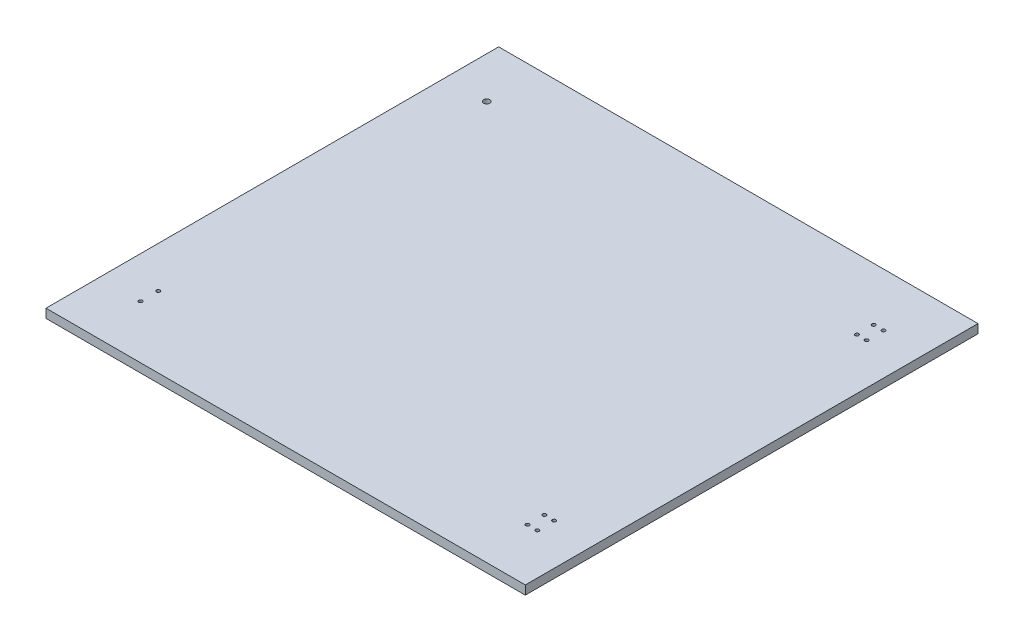
ISO-10303-21;
HEADER;
FILE_DESCRIPTION(('STEP AP214'),'2;1');
FILE_NAME('part.step','',(''),(''),'','','');
FILE_SCHEMA(('AUTOMOTIVE_DESIGN { 1 0 10303 214 1 1 1 1 }'));
ENDSEC;
DATA;
#1=APPLICATION_CONTEXT('core data for automotive mechanical design processes');
#2=APPLICATION_PROTOCOL_DEFINITION('international standard','automotive_design',2000,#1);
#3=PRODUCT_CONTEXT('',#1,'mechanical');
#4=PRODUCT('Part','Part','',(#3));
#5=PRODUCT_RELATED_PRODUCT_CATEGORY('part','',(#4));
#6=PRODUCT_DEFINITION_FORMATION('','',#4);
#7=PRODUCT_DEFINITION_CONTEXT('part definition',#1,'design');
#8=PRODUCT_DEFINITION('design','',#6,#7);
#9=PRODUCT_DEFINITION_SHAPE('','',#8);
#10=(LENGTH_UNIT() NAMED_UNIT(*) SI_UNIT(.MILLI.,.METRE.));
#11=(NAMED_UNIT(*) PLANE_ANGLE_UNIT() SI_UNIT($,.RADIAN.));
#12=(NAMED_UNIT(*) SI_UNIT($,.STERADIAN.) SOLID_ANGLE_UNIT());
#13=UNCERTAINTY_MEASURE_WITH_UNIT(LENGTH_MEASURE(1.E-05),#10,'distance_accuracy_value','');
#14=(GEOMETRIC_REPRESENTATION_CONTEXT(3) GLOBAL_UNCERTAINTY_ASSIGNED_CONTEXT((#13)) GLOBAL_UNIT_ASSIGNED_CONTEXT((#10,
#11,#12)) REPRESENTATION_CONTEXT('',''));
#15=CARTESIAN_POINT('',(0.,0.,0.));
#16=DIRECTION('',(0.,0.,1.));
#17=DIRECTION('',(1.,0.,0.));
#18=AXIS2_PLACEMENT_3D('',#15,#16,#17);
#19=CARTESIAN_POINT('',(-52.4300076297548,10.,-28.3185632013742));
#20=DIRECTION('',(1.,0.,0.));
#21=DIRECTION('',(0.,0.,-1.));
#22=AXIS2_PLACEMENT_3D('',#19,#20,#21);
#23=PLANE('',#22);
#24=DIRECTION('',(0.,0.,1.));
#25=VECTOR('',#24,1.);
#26=CARTESIAN_POINT('',(-52.4300076297548,0.,-28.3185632013742));
#27=LINE('',#26,#25);
#28=CARTESIAN_POINT('',(-52.4300076297548,0.,-28.3185632013742));
#29=VERTEX_POINT('',#28);
#30=CARTESIAN_POINT('',(-52.4300076297548,0.,481.681436798626));
#31=VERTEX_POINT('',#30);
#32=EDGE_CURVE('E108',#29,#31,#27,.T.);
#33=ORIENTED_EDGE('',*,*,#32,.T.);
#34=DIRECTION('',(0.,-1.,0.));
#35=VECTOR('',#34,1.);
#36=CARTESIAN_POINT('',(-52.4300076297548,10.,481.681436798626));
#37=LINE('',#36,#35);
#38=CARTESIAN_POINT('',(-52.4300076297548,10.,481.681436798626));
#39=VERTEX_POINT('',#38);
#40=EDGE_CURVE('E11',#39,#31,#37,.T.);
#41=ORIENTED_EDGE('',*,*,#40,.F.);
#42=DIRECTION('',(0.,0.,1.));
#43=VECTOR('',#42,1.);
#44=CARTESIAN_POINT('',(-52.4300076297548,10.,-28.3185632013742));
#45=LINE('',#44,#43);
#46=CARTESIAN_POINT('',(-52.4300076297548,10.,-28.3185632013742));
#47=VERTEX_POINT('',#46);
#48=EDGE_CURVE('E96',#47,#39,#45,.T.);
#49=ORIENTED_EDGE('',*,*,#48,.F.);
#50=DIRECTION('',(0.,-1.,0.));
#51=VECTOR('',#50,1.);
#52=CARTESIAN_POINT('',(-52.4300076297548,10.,-28.3185632013742));
#53=LINE('',#52,#51);
#54=EDGE_CURVE('E104',#47,#29,#53,.T.);
#55=ORIENTED_EDGE('',*,*,#54,.T.);
#56=EDGE_LOOP('',(#33,#41,#49,#55));
#57=FACE_BOUND('',#56,.T.);
#58=ADVANCED_FACE('F45',(#57),#23,.F.);
#59=CARTESIAN_POINT('',(-52.4300076297548,10.,481.681436798626));
#60=DIRECTION('',(0.,0.,-1.));
#61=DIRECTION('',(-1.,0.,0.));
#62=AXIS2_PLACEMENT_3D('',#59,#60,#61);
#63=PLANE('',#62);
#64=DIRECTION('',(1.,0.,0.));
#65=VECTOR('',#64,1.);
#66=CARTESIAN_POINT('',(-52.4300076297548,0.,481.681436798626));
#67=LINE('',#66,#65);
#68=CARTESIAN_POINT('',(487.569992370245,0.,481.681436798626));
#69=VERTEX_POINT('',#68);
#70=EDGE_CURVE('E100',#31,#69,#67,.T.);
#71=ORIENTED_EDGE('',*,*,#70,.T.);
#72=DIRECTION('',(0.,-1.,0.));
#73=VECTOR('',#72,1.);
#74=CARTESIAN_POINT('',(487.569992370245,10.,481.681436798626));
#75=LINE('',#74,#73);
#76=CARTESIAN_POINT('',(487.569992370245,10.,481.681436798626));
#77=VERTEX_POINT('',#76);
#78=EDGE_CURVE('E53',#77,#69,#75,.T.);
#79=ORIENTED_EDGE('',*,*,#78,.F.);
#80=DIRECTION('',(1.,0.,0.));
#81=VECTOR('',#80,1.);
#82=CARTESIAN_POINT('',(-52.4300076297548,10.,481.681436798626));
#83=LINE('',#82,#81);
#84=EDGE_CURVE('E91',#39,#77,#83,.T.);
#85=ORIENTED_EDGE('',*,*,#84,.F.);
#86=ORIENTED_EDGE('',*,*,#40,.T.);
#87=EDGE_LOOP('',(#71,#79,#85,#86));
#88=FACE_BOUND('',#87,.T.);
#89=ADVANCED_FACE('F99',(#88),#63,.F.);
#90=CARTESIAN_POINT('',(487.569992370245,10.,-28.3185632013742));
#91=DIRECTION('',(-1.,0.,0.));
#92=DIRECTION('',(0.,0.,1.));
#93=AXIS2_PLACEMENT_3D('',#90,#91,#92);
#94=PLANE('',#93);
#95=DIRECTION('',(0.,0.,-1.));
#96=VECTOR('',#95,1.);
#97=CARTESIAN_POINT('',(487.569992370245,0.,-28.3185632013742));
#98=LINE('',#97,#96);
#99=CARTESIAN_POINT('',(487.569992370245,0.,-28.3185632013742));
#100=VERTEX_POINT('',#99);
#101=EDGE_CURVE('E78',#69,#100,#98,.T.);
#102=ORIENTED_EDGE('',*,*,#101,.T.);
#103=DIRECTION('',(0.,-1.,0.));
#104=VECTOR('',#103,1.);
#105=CARTESIAN_POINT('',(487.569992370245,10.,-28.3185632013742));
#106=LINE('',#105,#104);
#107=CARTESIAN_POINT('',(487.569992370245,10.,-28.3185632013742));
#108=VERTEX_POINT('',#107);
#109=EDGE_CURVE('E101',#108,#100,#106,.T.);
#110=ORIENTED_EDGE('',*,*,#109,.F.);
#111=DIRECTION('',(0.,0.,-1.));
#112=VECTOR('',#111,1.);
#113=CARTESIAN_POINT('',(487.569992370245,10.,-28.3185632013742));
#114=LINE('',#113,#112);
#115=EDGE_CURVE('E94',#77,#108,#114,.T.);
#116=ORIENTED_EDGE('',*,*,#115,.F.);
#117=ORIENTED_EDGE('',*,*,#78,.T.);
#118=EDGE_LOOP('',(#102,#110,#116,#117));
#119=FACE_BOUND('',#118,.T.);
#120=ADVANCED_FACE('F102',(#119),#94,.F.);
#121=CARTESIAN_POINT('',(-52.4300076297548,10.,-28.3185632013742));
#122=DIRECTION('',(0.,0.,1.));
#123=DIRECTION('',(1.,0.,0.));
#124=AXIS2_PLACEMENT_3D('',#121,#122,#123);
#125=PLANE('',#124);
#126=DIRECTION('',(-1.,0.,0.));
#127=VECTOR('',#126,1.);
#128=CARTESIAN_POINT('',(-52.4300076297548,0.,-28.3185632013742));
#129=LINE('',#128,#127);
#130=EDGE_CURVE('E84',#100,#29,#129,.T.);
#131=ORIENTED_EDGE('',*,*,#130,.T.);
#132=ORIENTED_EDGE('',*,*,#54,.F.);
#133=DIRECTION('',(-1.,0.,0.));
#134=VECTOR('',#133,1.);
#135=CARTESIAN_POINT('',(-52.4300076297548,10.,-28.3185632013742));
#136=LINE('',#135,#134);
#137=EDGE_CURVE('E61',#108,#47,#136,.T.);
#138=ORIENTED_EDGE('',*,*,#137,.F.);
#139=ORIENTED_EDGE('',*,*,#109,.T.);
#140=EDGE_LOOP('',(#131,#132,#138,#139));
#141=FACE_BOUND('',#140,.T.);
#142=ADVANCED_FACE('F116',(#141),#125,.F.);
#143=CARTESIAN_POINT('',(0.,10.,0.));
#144=DIRECTION('',(0.,1.,0.));
#145=DIRECTION('',(0.,0.,1.));
#146=AXIS2_PLACEMENT_3D('',#143,#144,#145);
#147=PLANE('',#146);
#148=CARTESIAN_POINT('',(-5.93000762975478,10.,421.681436798626));
#149=DIRECTION('',(0.,-1.,0.));
#150=DIRECTION('',(0.,0.,-1.));
#151=AXIS2_PLACEMENT_3D('',#148,#149,#150);
#152=CIRCLE('',#151,1.99999999999999);
#153=CARTESIAN_POINT('',(-5.93000762975478,10.,419.681436798626));
#154=VERTEX_POINT('',#153);
#155=EDGE_CURVE('E173',#154,#154,#152,.T.);
#156=ORIENTED_EDGE('',*,*,#155,.T.);
#157=EDGE_LOOP('',(#156));
#158=FACE_BOUND('',#157,.T.);
#159=CARTESIAN_POINT('',(-5.93000762975478,10.,401.681436798626));
#160=DIRECTION('',(0.,-1.,0.));
#161=DIRECTION('',(0.,0.,-1.));
#162=AXIS2_PLACEMENT_3D('',#159,#160,#161);
#163=CIRCLE('',#162,2.);
#164=CARTESIAN_POINT('',(-5.93000762975478,10.,399.681436798626));
#165=VERTEX_POINT('',#164);
#166=EDGE_CURVE('E179',#165,#165,#163,.T.);
#167=ORIENTED_EDGE('',*,*,#166,.T.);
#168=EDGE_LOOP('',(#167));
#169=FACE_BOUND('',#168,.T.);
#170=CARTESIAN_POINT('',(-5.93000762975478,10.,31.6814367986258));
#171=DIRECTION('',(0.,-1.,0.));
#172=DIRECTION('',(0.,0.,-1.));
#173=AXIS2_PLACEMENT_3D('',#170,#171,#172);
#174=CIRCLE('',#173,3.5);
#175=CARTESIAN_POINT('',(-5.93000762975478,10.,28.1814367986258));
#176=VERTEX_POINT('',#175);
#177=EDGE_CURVE('E167',#176,#176,#174,.T.);
#178=ORIENTED_EDGE('',*,*,#177,.T.);
#179=EDGE_LOOP('',(#178));
#180=FACE_BOUND('',#179,.T.);
#181=CARTESIAN_POINT('',(441.069992370245,10.,402.681436798626));
#182=DIRECTION('',(0.,-1.,0.));
#183=DIRECTION('',(0.,0.,-1.));
#184=AXIS2_PLACEMENT_3D('',#181,#182,#183);
#185=CIRCLE('',#184,2.);
#186=CARTESIAN_POINT('',(441.069992370245,10.,400.681436798626));
#187=VERTEX_POINT('',#186);
#188=EDGE_CURVE('E149',#187,#187,#185,.T.);
#189=ORIENTED_EDGE('',*,*,#188,.T.);
#190=EDGE_LOOP('',(#189));
#191=FACE_BOUND('',#190,.T.);
#192=CARTESIAN_POINT('',(430.069992370245,10.,421.681436798626));
#193=DIRECTION('',(0.,-1.,0.));
#194=DIRECTION('',(0.,0.,-1.));
#195=AXIS2_PLACEMENT_3D('',#192,#193,#194);
#196=CIRCLE('',#195,2.);
#197=CARTESIAN_POINT('',(430.069992370245,10.,419.681436798626));
#198=VERTEX_POINT('',#197);
#199=EDGE_CURVE('E155',#198,#198,#196,.T.);
#200=ORIENTED_EDGE('',*,*,#199,.T.);
#201=EDGE_LOOP('',(#200));
#202=FACE_BOUND('',#201,.T.);
#203=CARTESIAN_POINT('',(430.069992370245,10.,402.681436798626));
#204=DIRECTION('',(0.,-1.,0.));
#205=DIRECTION('',(0.,0.,-1.));
#206=AXIS2_PLACEMENT_3D('',#203,#204,#205);
#207=CIRCLE('',#206,2.);
#208=CARTESIAN_POINT('',(430.069992370245,10.,400.681436798626));
#209=VERTEX_POINT('',#208);
#210=EDGE_CURVE('E156',#209,#209,#207,.T.);
#211=ORIENTED_EDGE('',*,*,#210,.T.);
#212=EDGE_LOOP('',(#211));
#213=FACE_BOUND('',#212,.T.);
#214=CARTESIAN_POINT('',(441.069992370245,10.,421.681436798626));
#215=DIRECTION('',(0.,-1.,0.));
#216=DIRECTION('',(0.,0.,-1.));
#217=AXIS2_PLACEMENT_3D('',#214,#215,#216);
#218=CIRCLE('',#217,2.);
#219=CARTESIAN_POINT('',(441.069992370245,10.,419.681436798626));
#220=VERTEX_POINT('',#219);
#221=EDGE_CURVE('E143',#220,#220,#218,.T.);
#222=ORIENTED_EDGE('',*,*,#221,.T.);
#223=EDGE_LOOP('',(#222));
#224=FACE_BOUND('',#223,.T.);
#225=CARTESIAN_POINT('',(430.069992370245,10.,31.6814367986258));
#226=DIRECTION('',(0.,1.,0.));
#227=DIRECTION('',(0.,0.,1.));
#228=AXIS2_PLACEMENT_3D('',#225,#226,#227);
#229=CIRCLE('',#228,2.);
#230=CARTESIAN_POINT('',(430.069992370245,10.,33.6814367986258));
#231=VERTEX_POINT('',#230);
#232=EDGE_CURVE('E135',#231,#231,#229,.T.);
#233=ORIENTED_EDGE('',*,*,#232,.F.);
#234=EDGE_LOOP('',(#233));
#235=FACE_BOUND('',#234,.T.);
#236=CARTESIAN_POINT('',(441.069992370245,10.,50.6814367986258));
#237=DIRECTION('',(0.,1.,0.));
#238=DIRECTION('',(0.,0.,1.));
#239=AXIS2_PLACEMENT_3D('',#236,#237,#238);
#240=CIRCLE('',#239,2.);
#241=CARTESIAN_POINT('',(441.069992370245,10.,52.6814367986258));
#242=VERTEX_POINT('',#241);
#243=EDGE_CURVE('E128',#242,#242,#240,.T.);
#244=ORIENTED_EDGE('',*,*,#243,.F.);
#245=EDGE_LOOP('',(#244));
#246=FACE_BOUND('',#245,.T.);
#247=CARTESIAN_POINT('',(430.069992370245,10.,50.6814367986258));
#248=DIRECTION('',(0.,1.,0.));
#249=DIRECTION('',(0.,0.,1.));
#250=AXIS2_PLACEMENT_3D('',#247,#248,#249);
#251=CIRCLE('',#250,2.);
#252=CARTESIAN_POINT('',(430.069992370245,10.,52.6814367986258));
#253=VERTEX_POINT('',#252);
#254=EDGE_CURVE('E140',#253,#253,#251,.T.);
#255=ORIENTED_EDGE('',*,*,#254,.F.);
#256=EDGE_LOOP('',(#255));
#257=FACE_BOUND('',#256,.T.);
#258=CARTESIAN_POINT('',(441.069992370245,10.,31.6814367986258));
#259=DIRECTION('',(0.,1.,0.));
#260=DIRECTION('',(0.,0.,1.));
#261=AXIS2_PLACEMENT_3D('',#258,#259,#260);
#262=CIRCLE('',#261,2.);
#263=CARTESIAN_POINT('',(441.069992370245,10.,33.6814367986258));
#264=VERTEX_POINT('',#263);
#265=EDGE_CURVE('E122',#264,#264,#262,.T.);
#266=ORIENTED_EDGE('',*,*,#265,.F.);
#267=EDGE_LOOP('',(#266));
#268=FACE_BOUND('',#267,.T.);
#269=ORIENTED_EDGE('',*,*,#48,.T.);
#270=ORIENTED_EDGE('',*,*,#84,.T.);
#271=ORIENTED_EDGE('',*,*,#115,.T.);
#272=ORIENTED_EDGE('',*,*,#137,.T.);
#273=EDGE_LOOP('',(#269,#270,#271,#272));
#274=FACE_BOUND('',#273,.T.);
#275=ADVANCED_FACE('F92',(#158,#169,#180,#191,#202,#213,#224,#235,#246,#257,#268,#274),#147,.T.);
#276=CARTESIAN_POINT('',(0.,0.,0.));
#277=DIRECTION('',(0.,1.,0.));
#278=DIRECTION('',(0.,0.,1.));
#279=AXIS2_PLACEMENT_3D('',#276,#277,#278);
#280=PLANE('',#279);
#281=CARTESIAN_POINT('',(-5.93000762975478,0.,421.681436798626));
#282=DIRECTION('',(0.,-1.,0.));
#283=DIRECTION('',(0.,0.,-1.));
#284=AXIS2_PLACEMENT_3D('',#281,#282,#283);
#285=CIRCLE('',#284,1.99999999999999);
#286=CARTESIAN_POINT('',(-5.93000762975478,0.,419.681436798626));
#287=VERTEX_POINT('',#286);
#288=EDGE_CURVE('E182',#287,#287,#285,.T.);
#289=ORIENTED_EDGE('',*,*,#288,.F.);
#290=EDGE_LOOP('',(#289));
#291=FACE_BOUND('',#290,.T.);
#292=CARTESIAN_POINT('',(-5.93000762975478,0.,401.681436798626));
#293=DIRECTION('',(0.,-1.,0.));
#294=DIRECTION('',(0.,0.,-1.));
#295=AXIS2_PLACEMENT_3D('',#292,#293,#294);
#296=CIRCLE('',#295,2.);
#297=CARTESIAN_POINT('',(-5.93000762975478,0.,399.681436798626));
#298=VERTEX_POINT('',#297);
#299=EDGE_CURVE('E176',#298,#298,#296,.T.);
#300=ORIENTED_EDGE('',*,*,#299,.F.);
#301=EDGE_LOOP('',(#300));
#302=FACE_BOUND('',#301,.T.);
#303=CARTESIAN_POINT('',(-5.93000762975478,0.,31.6814367986258));
#304=DIRECTION('',(0.,-1.,0.));
#305=DIRECTION('',(0.,0.,-1.));
#306=AXIS2_PLACEMENT_3D('',#303,#304,#305);
#307=CIRCLE('',#306,3.5);
#308=CARTESIAN_POINT('',(-5.93000762975478,0.,28.1814367986258));
#309=VERTEX_POINT('',#308);
#310=EDGE_CURVE('E170',#309,#309,#307,.T.);
#311=ORIENTED_EDGE('',*,*,#310,.F.);
#312=EDGE_LOOP('',(#311));
#313=FACE_BOUND('',#312,.T.);
#314=CARTESIAN_POINT('',(441.069992370245,0.,402.681436798626));
#315=DIRECTION('',(0.,-1.,0.));
#316=DIRECTION('',(0.,0.,-1.));
#317=AXIS2_PLACEMENT_3D('',#314,#315,#316);
#318=CIRCLE('',#317,2.);
#319=CARTESIAN_POINT('',(441.069992370245,0.,400.681436798626));
#320=VERTEX_POINT('',#319);
#321=EDGE_CURVE('E159',#320,#320,#318,.T.);
#322=ORIENTED_EDGE('',*,*,#321,.F.);
#323=EDGE_LOOP('',(#322));
#324=FACE_BOUND('',#323,.T.);
#325=CARTESIAN_POINT('',(430.069992370245,0.,421.681436798626));
#326=DIRECTION('',(0.,-1.,0.));
#327=DIRECTION('',(0.,0.,-1.));
#328=AXIS2_PLACEMENT_3D('',#325,#326,#327);
#329=CIRCLE('',#328,2.);
#330=CARTESIAN_POINT('',(430.069992370245,0.,419.681436798626));
#331=VERTEX_POINT('',#330);
#332=EDGE_CURVE('E152',#331,#331,#329,.T.);
#333=ORIENTED_EDGE('',*,*,#332,.F.);
#334=EDGE_LOOP('',(#333));
#335=FACE_BOUND('',#334,.T.);
#336=CARTESIAN_POINT('',(430.069992370245,0.,402.681436798626));
#337=DIRECTION('',(0.,-1.,0.));
#338=DIRECTION('',(0.,0.,-1.));
#339=AXIS2_PLACEMENT_3D('',#336,#337,#338);
#340=CIRCLE('',#339,2.);
#341=CARTESIAN_POINT('',(430.069992370245,0.,400.681436798626));
#342=VERTEX_POINT('',#341);
#343=EDGE_CURVE('E164',#342,#342,#340,.T.);
#344=ORIENTED_EDGE('',*,*,#343,.F.);
#345=EDGE_LOOP('',(#344));
#346=FACE_BOUND('',#345,.T.);
#347=CARTESIAN_POINT('',(441.069992370245,0.,421.681436798626));
#348=DIRECTION('',(0.,-1.,0.));
#349=DIRECTION('',(0.,0.,-1.));
#350=AXIS2_PLACEMENT_3D('',#347,#348,#349);
#351=CIRCLE('',#350,2.);
#352=CARTESIAN_POINT('',(441.069992370245,0.,419.681436798626));
#353=VERTEX_POINT('',#352);
#354=EDGE_CURVE('E146',#353,#353,#351,.T.);
#355=ORIENTED_EDGE('',*,*,#354,.F.);
#356=EDGE_LOOP('',(#355));
#357=FACE_BOUND('',#356,.T.);
#358=CARTESIAN_POINT('',(430.069992370245,0.,31.6814367986258));
#359=DIRECTION('',(0.,1.,0.));
#360=DIRECTION('',(0.,0.,1.));
#361=AXIS2_PLACEMENT_3D('',#358,#359,#360);
#362=CIRCLE('',#361,2.);
#363=CARTESIAN_POINT('',(430.069992370245,0.,33.6814367986258));
#364=VERTEX_POINT('',#363);
#365=EDGE_CURVE('E125',#364,#364,#362,.T.);
#366=ORIENTED_EDGE('',*,*,#365,.T.);
#367=EDGE_LOOP('',(#366));
#368=FACE_BOUND('',#367,.T.);
#369=CARTESIAN_POINT('',(441.069992370245,0.,50.6814367986258));
#370=DIRECTION('',(0.,1.,0.));
#371=DIRECTION('',(0.,0.,1.));
#372=AXIS2_PLACEMENT_3D('',#369,#370,#371);
#373=CIRCLE('',#372,2.);
#374=CARTESIAN_POINT('',(441.069992370245,0.,52.6814367986258));
#375=VERTEX_POINT('',#374);
#376=EDGE_CURVE('E131',#375,#375,#373,.T.);
#377=ORIENTED_EDGE('',*,*,#376,.T.);
#378=EDGE_LOOP('',(#377));
#379=FACE_BOUND('',#378,.T.);
#380=CARTESIAN_POINT('',(430.069992370245,0.,50.6814367986258));
#381=DIRECTION('',(0.,1.,0.));
#382=DIRECTION('',(0.,0.,1.));
#383=AXIS2_PLACEMENT_3D('',#380,#381,#382);
#384=CIRCLE('',#383,2.);
#385=CARTESIAN_POINT('',(430.069992370245,0.,52.6814367986258));
#386=VERTEX_POINT('',#385);
#387=EDGE_CURVE('E132',#386,#386,#384,.T.);
#388=ORIENTED_EDGE('',*,*,#387,.T.);
#389=EDGE_LOOP('',(#388));
#390=FACE_BOUND('',#389,.T.);
#391=CARTESIAN_POINT('',(441.069992370245,0.,31.6814367986258));
#392=DIRECTION('',(0.,1.,0.));
#393=DIRECTION('',(0.,0.,1.));
#394=AXIS2_PLACEMENT_3D('',#391,#392,#393);
#395=CIRCLE('',#394,2.);
#396=CARTESIAN_POINT('',(441.069992370245,0.,33.6814367986258));
#397=VERTEX_POINT('',#396);
#398=EDGE_CURVE('E111',#397,#397,#395,.T.);
#399=ORIENTED_EDGE('',*,*,#398,.T.);
#400=EDGE_LOOP('',(#399));
#401=FACE_BOUND('',#400,.T.);
#402=ORIENTED_EDGE('',*,*,#32,.F.);
#403=ORIENTED_EDGE('',*,*,#130,.F.);
#404=ORIENTED_EDGE('',*,*,#101,.F.);
#405=ORIENTED_EDGE('',*,*,#70,.F.);
#406=EDGE_LOOP('',(#402,#403,#404,#405));
#407=FACE_BOUND('',#406,.T.);
#408=ADVANCED_FACE('F119',(#291,#302,#313,#324,#335,#346,#357,#368,#379,#390,#401,#407),#280,.F.);
#409=CARTESIAN_POINT('',(441.069992370245,0.,31.6814367986258));
#410=DIRECTION('',(0.,1.,0.));
#411=DIRECTION('',(0.,0.,1.));
#412=AXIS2_PLACEMENT_3D('',#409,#410,#411);
#413=CYLINDRICAL_SURFACE('',#412,2.);
#414=ORIENTED_EDGE('',*,*,#398,.F.);
#415=EDGE_LOOP('',(#414));
#416=FACE_BOUND('',#415,.T.);
#417=ORIENTED_EDGE('',*,*,#265,.T.);
#418=EDGE_LOOP('',(#417));
#419=FACE_BOUND('',#418,.T.);
#420=ADVANCED_FACE('F199',(#416,#419),#413,.F.);
#421=CARTESIAN_POINT('',(430.069992370245,0.,50.6814367986258));
#422=DIRECTION('',(0.,1.,0.));
#423=DIRECTION('',(0.,0.,1.));
#424=AXIS2_PLACEMENT_3D('',#421,#422,#423);
#425=CYLINDRICAL_SURFACE('',#424,2.);
#426=ORIENTED_EDGE('',*,*,#387,.F.);
#427=EDGE_LOOP('',(#426));
#428=FACE_BOUND('',#427,.T.);
#429=ORIENTED_EDGE('',*,*,#254,.T.);
#430=EDGE_LOOP('',(#429));
#431=FACE_BOUND('',#430,.T.);
#432=ADVANCED_FACE('F223',(#428,#431),#425,.F.);
#433=CARTESIAN_POINT('',(441.069992370245,0.,50.6814367986258));
#434=DIRECTION('',(0.,1.,0.));
#435=DIRECTION('',(0.,0.,1.));
#436=AXIS2_PLACEMENT_3D('',#433,#434,#435);
#437=CYLINDRICAL_SURFACE('',#436,2.);
#438=ORIENTED_EDGE('',*,*,#376,.F.);
#439=EDGE_LOOP('',(#438));
#440=FACE_BOUND('',#439,.T.);
#441=ORIENTED_EDGE('',*,*,#243,.T.);
#442=EDGE_LOOP('',(#441));
#443=FACE_BOUND('',#442,.T.);
#444=ADVANCED_FACE('F264',(#440,#443),#437,.F.);
#445=CARTESIAN_POINT('',(430.069992370245,0.,31.6814367986258));
#446=DIRECTION('',(0.,1.,0.));
#447=DIRECTION('',(0.,0.,1.));
#448=AXIS2_PLACEMENT_3D('',#445,#446,#447);
#449=CYLINDRICAL_SURFACE('',#448,2.);
#450=ORIENTED_EDGE('',*,*,#365,.F.);
#451=EDGE_LOOP('',(#450));
#452=FACE_BOUND('',#451,.T.);
#453=ORIENTED_EDGE('',*,*,#232,.T.);
#454=EDGE_LOOP('',(#453));
#455=FACE_BOUND('',#454,.T.);
#456=ADVANCED_FACE('F274',(#452,#455),#449,.F.);
#457=CARTESIAN_POINT('',(441.069992370245,10.,421.681436798626));
#458=DIRECTION('',(0.,-1.,0.));
#459=DIRECTION('',(0.,0.,-1.));
#460=AXIS2_PLACEMENT_3D('',#457,#458,#459);
#461=CYLINDRICAL_SURFACE('',#460,2.);
#462=ORIENTED_EDGE('',*,*,#221,.F.);
#463=EDGE_LOOP('',(#462));
#464=FACE_BOUND('',#463,.T.);
#465=ORIENTED_EDGE('',*,*,#354,.T.);
#466=EDGE_LOOP('',(#465));
#467=FACE_BOUND('',#466,.T.);
#468=ADVANCED_FACE('F284',(#464,#467),#461,.F.);
#469=CARTESIAN_POINT('',(430.069992370245,10.,402.681436798626));
#470=DIRECTION('',(0.,-1.,0.));
#471=DIRECTION('',(0.,0.,-1.));
#472=AXIS2_PLACEMENT_3D('',#469,#470,#471);
#473=CYLINDRICAL_SURFACE('',#472,2.);
#474=ORIENTED_EDGE('',*,*,#210,.F.);
#475=EDGE_LOOP('',(#474));
#476=FACE_BOUND('',#475,.T.);
#477=ORIENTED_EDGE('',*,*,#343,.T.);
#478=EDGE_LOOP('',(#477));
#479=FACE_BOUND('',#478,.T.);
#480=ADVANCED_FACE('F294',(#476,#479),#473,.F.);
#481=CARTESIAN_POINT('',(430.069992370245,10.,421.681436798626));
#482=DIRECTION('',(0.,-1.,0.));
#483=DIRECTION('',(0.,0.,-1.));
#484=AXIS2_PLACEMENT_3D('',#481,#482,#483);
#485=CYLINDRICAL_SURFACE('',#484,2.);
#486=ORIENTED_EDGE('',*,*,#199,.F.);
#487=EDGE_LOOP('',(#486));
#488=FACE_BOUND('',#487,.T.);
#489=ORIENTED_EDGE('',*,*,#332,.T.);
#490=EDGE_LOOP('',(#489));
#491=FACE_BOUND('',#490,.T.);
#492=ADVANCED_FACE('F304',(#488,#491),#485,.F.);
#493=CARTESIAN_POINT('',(441.069992370245,10.,402.681436798626));
#494=DIRECTION('',(0.,-1.,0.));
#495=DIRECTION('',(0.,0.,-1.));
#496=AXIS2_PLACEMENT_3D('',#493,#494,#495);
#497=CYLINDRICAL_SURFACE('',#496,2.);
#498=ORIENTED_EDGE('',*,*,#188,.F.);
#499=EDGE_LOOP('',(#498));
#500=FACE_BOUND('',#499,.T.);
#501=ORIENTED_EDGE('',*,*,#321,.T.);
#502=EDGE_LOOP('',(#501));
#503=FACE_BOUND('',#502,.T.);
#504=ADVANCED_FACE('F314',(#500,#503),#497,.F.);
#505=CARTESIAN_POINT('',(-5.93000762975478,10.,31.6814367986258));
#506=DIRECTION('',(0.,-1.,0.));
#507=DIRECTION('',(0.,0.,-1.));
#508=AXIS2_PLACEMENT_3D('',#505,#506,#507);
#509=CYLINDRICAL_SURFACE('',#508,3.5);
#510=ORIENTED_EDGE('',*,*,#177,.F.);
#511=EDGE_LOOP('',(#510));
#512=FACE_BOUND('',#511,.T.);
#513=ORIENTED_EDGE('',*,*,#310,.T.);
#514=EDGE_LOOP('',(#513));
#515=FACE_BOUND('',#514,.T.);
#516=ADVANCED_FACE('F324',(#512,#515),#509,.F.);
#517=CARTESIAN_POINT('',(-5.93000762975478,10.,401.681436798626));
#518=DIRECTION('',(0.,-1.,0.));
#519=DIRECTION('',(0.,0.,-1.));
#520=AXIS2_PLACEMENT_3D('',#517,#518,#519);
#521=CYLINDRICAL_SURFACE('',#520,2.);
#522=ORIENTED_EDGE('',*,*,#166,.F.);
#523=EDGE_LOOP('',(#522));
#524=FACE_BOUND('',#523,.T.);
#525=ORIENTED_EDGE('',*,*,#299,.T.);
#526=EDGE_LOOP('',(#525));
#527=FACE_BOUND('',#526,.T.);
#528=ADVANCED_FACE('F193',(#524,#527),#521,.F.);
#529=CARTESIAN_POINT('',(-5.93000762975478,10.,421.681436798626));
#530=DIRECTION('',(0.,-1.,0.));
#531=DIRECTION('',(0.,0.,-1.));
#532=AXIS2_PLACEMENT_3D('',#529,#530,#531);
#533=CYLINDRICAL_SURFACE('',#532,1.99999999999999);
#534=ORIENTED_EDGE('',*,*,#155,.F.);
#535=EDGE_LOOP('',(#534));
#536=FACE_BOUND('',#535,.T.);
#537=ORIENTED_EDGE('',*,*,#288,.T.);
#538=EDGE_LOOP('',(#537));
#539=FACE_BOUND('',#538,.T.);
#540=ADVANCED_FACE('F190',(#536,#539),#533,.F.);
#541=CLOSED_SHELL('',(#58,#89,#120,#142,#275,#408,#420,#432,#444,#456,#468,#480,#492,#504,#516,
#528,#540));
#542=MANIFOLD_SOLID_BREP('B2',#541);
#543=ADVANCED_BREP_SHAPE_REPRESENTATION('',(#18,#542),#14);
#544=SHAPE_DEFINITION_REPRESENTATION(#9,#543);
ENDSEC;
END-ISO-10303-21;
